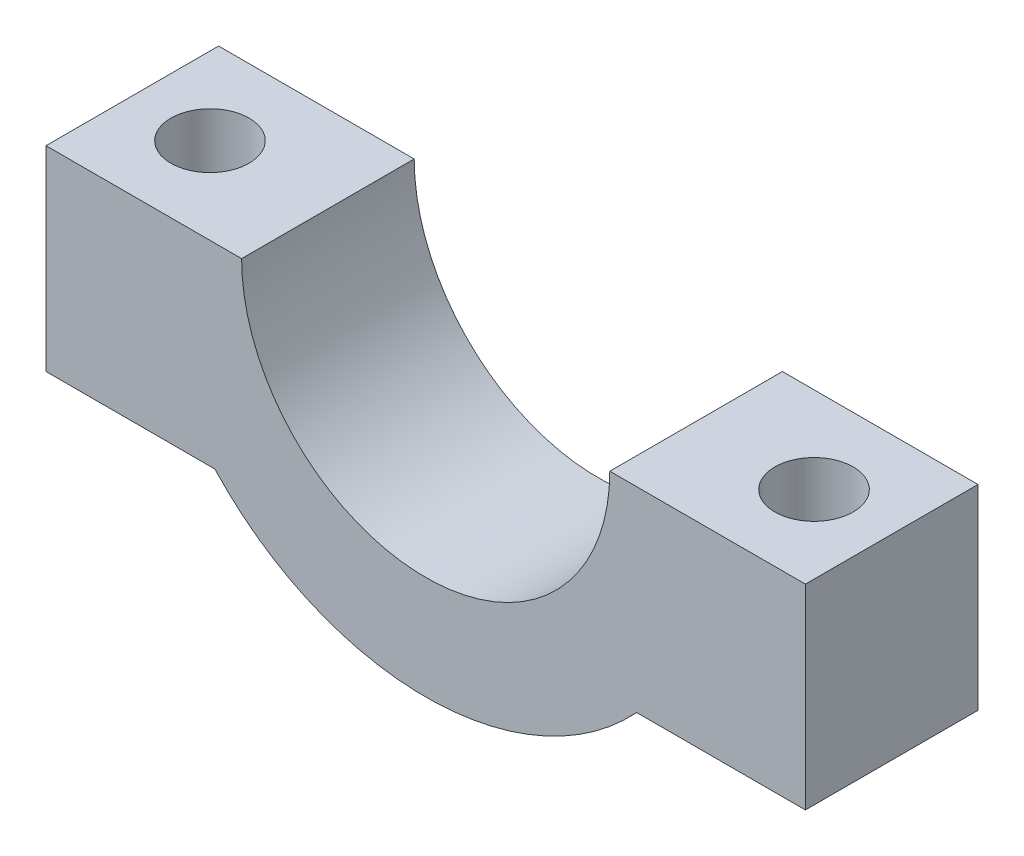
ISO-10303-21;
HEADER;
FILE_DESCRIPTION(('STEP AP214'),'2;1');
FILE_NAME('part.step','',(''),(''),'','','');
FILE_SCHEMA(('AUTOMOTIVE_DESIGN { 1 0 10303 214 1 1 1 1 }'));
ENDSEC;
DATA;
#1=APPLICATION_CONTEXT('core data for automotive mechanical design processes');
#2=APPLICATION_PROTOCOL_DEFINITION('international standard','automotive_design',2000,#1);
#3=PRODUCT_CONTEXT('',#1,'mechanical');
#4=PRODUCT('Part','Part','',(#3));
#5=PRODUCT_RELATED_PRODUCT_CATEGORY('part','',(#4));
#6=PRODUCT_DEFINITION_FORMATION('','',#4);
#7=PRODUCT_DEFINITION_CONTEXT('part definition',#1,'design');
#8=PRODUCT_DEFINITION('design','',#6,#7);
#9=PRODUCT_DEFINITION_SHAPE('','',#8);
#10=(LENGTH_UNIT() NAMED_UNIT(*) SI_UNIT(.MILLI.,.METRE.));
#11=(NAMED_UNIT(*) PLANE_ANGLE_UNIT() SI_UNIT($,.RADIAN.));
#12=(NAMED_UNIT(*) SI_UNIT($,.STERADIAN.) SOLID_ANGLE_UNIT());
#13=UNCERTAINTY_MEASURE_WITH_UNIT(LENGTH_MEASURE(1.E-05),#10,'distance_accuracy_value','');
#14=(GEOMETRIC_REPRESENTATION_CONTEXT(3) GLOBAL_UNCERTAINTY_ASSIGNED_CONTEXT((#13)) GLOBAL_UNIT_ASSIGNED_CONTEXT((#10,
#11,#12)) REPRESENTATION_CONTEXT('',''));
#15=CARTESIAN_POINT('',(0.,0.,0.));
#16=DIRECTION('',(0.,0.,1.));
#17=DIRECTION('',(1.,0.,0.));
#18=AXIS2_PLACEMENT_3D('',#15,#16,#17);
#19=CARTESIAN_POINT('',(0.,0.,-7.5));
#20=DIRECTION('',(0.,0.,1.));
#21=DIRECTION('',(1.,0.,0.));
#22=AXIS2_PLACEMENT_3D('',#19,#20,#21);
#23=CYLINDRICAL_SURFACE('',#22,16.);
#24=DIRECTION('',(0.,0.,1.));
#25=VECTOR('',#24,1.);
#26=CARTESIAN_POINT('',(-16.,0.,-7.5));
#27=LINE('',#26,#25);
#28=CARTESIAN_POINT('',(-16.,0.,-7.5));
#29=VERTEX_POINT('',#28);
#30=CARTESIAN_POINT('',(-16.,0.,7.5));
#31=VERTEX_POINT('',#30);
#32=EDGE_CURVE('E40',#29,#31,#27,.T.);
#33=ORIENTED_EDGE('',*,*,#32,.T.);
#34=CARTESIAN_POINT('',(0.,0.,7.5));
#35=DIRECTION('',(0.,0.,-1.));
#36=DIRECTION('',(-1.,0.,0.));
#37=AXIS2_PLACEMENT_3D('',#34,#35,#36);
#38=CIRCLE('',#37,16.);
#39=CARTESIAN_POINT('',(16.,0.,7.5));
#40=VERTEX_POINT('',#39);
#41=EDGE_CURVE('E101',#40,#31,#38,.T.);
#42=ORIENTED_EDGE('',*,*,#41,.F.);
#43=DIRECTION('',(0.,0.,1.));
#44=VECTOR('',#43,1.);
#45=CARTESIAN_POINT('',(16.,0.,-7.5));
#46=LINE('',#45,#44);
#47=CARTESIAN_POINT('',(16.,0.,-7.5));
#48=VERTEX_POINT('',#47);
#49=EDGE_CURVE('E11',#48,#40,#46,.T.);
#50=ORIENTED_EDGE('',*,*,#49,.F.);
#51=CARTESIAN_POINT('',(0.,0.,-7.5));
#52=DIRECTION('',(0.,0.,-1.));
#53=DIRECTION('',(-1.,0.,0.));
#54=AXIS2_PLACEMENT_3D('',#51,#52,#53);
#55=CIRCLE('',#54,16.);
#56=EDGE_CURVE('E102',#48,#29,#55,.T.);
#57=ORIENTED_EDGE('',*,*,#56,.T.);
#58=EDGE_LOOP('',(#33,#42,#50,#57));
#59=FACE_BOUND('',#58,.T.);
#60=ADVANCED_FACE('F37',(#59),#23,.F.);
#61=CARTESIAN_POINT('',(33.,0.,-7.5));
#62=DIRECTION('',(0.,1.,0.));
#63=DIRECTION('',(-1.,0.,0.));
#64=AXIS2_PLACEMENT_3D('',#61,#62,#63);
#65=PLANE('',#64);
#66=CARTESIAN_POINT('',(26.25,0.,0.));
#67=DIRECTION('',(0.,-1.,0.));
#68=DIRECTION('',(0.,0.,-1.));
#69=AXIS2_PLACEMENT_3D('',#66,#67,#68);
#70=CIRCLE('',#69,3.4);
#71=CARTESIAN_POINT('',(26.25,0.,-3.4));
#72=VERTEX_POINT('',#71);
#73=EDGE_CURVE('E120',#72,#72,#70,.T.);
#74=ORIENTED_EDGE('',*,*,#73,.T.);
#75=EDGE_LOOP('',(#74));
#76=FACE_BOUND('',#75,.T.);
#77=ORIENTED_EDGE('',*,*,#49,.T.);
#78=DIRECTION('',(-1.,0.,0.));
#79=VECTOR('',#78,1.);
#80=CARTESIAN_POINT('',(33.,0.,7.5));
#81=LINE('',#80,#79);
#82=CARTESIAN_POINT('',(33.,0.,7.5));
#83=VERTEX_POINT('',#82);
#84=EDGE_CURVE('E119',#83,#40,#81,.T.);
#85=ORIENTED_EDGE('',*,*,#84,.F.);
#86=DIRECTION('',(0.,0.,1.));
#87=VECTOR('',#86,1.);
#88=CARTESIAN_POINT('',(33.,0.,-7.5));
#89=LINE('',#88,#87);
#90=CARTESIAN_POINT('',(33.,0.,-7.5));
#91=VERTEX_POINT('',#90);
#92=EDGE_CURVE('E45',#91,#83,#89,.T.);
#93=ORIENTED_EDGE('',*,*,#92,.F.);
#94=DIRECTION('',(-1.,0.,0.));
#95=VECTOR('',#94,1.);
#96=CARTESIAN_POINT('',(33.,0.,-7.5));
#97=LINE('',#96,#95);
#98=EDGE_CURVE('E107',#91,#48,#97,.T.);
#99=ORIENTED_EDGE('',*,*,#98,.T.);
#100=EDGE_LOOP('',(#77,#85,#93,#99));
#101=FACE_BOUND('',#100,.T.);
#102=ADVANCED_FACE('F188',(#76,#101),#65,.T.);
#103=CARTESIAN_POINT('',(33.,-17.,-7.5));
#104=DIRECTION('',(1.,0.,0.));
#105=DIRECTION('',(0.,0.,-1.));
#106=AXIS2_PLACEMENT_3D('',#103,#104,#105);
#107=PLANE('',#106);
#108=ORIENTED_EDGE('',*,*,#92,.T.);
#109=DIRECTION('',(0.,1.,0.));
#110=VECTOR('',#109,1.);
#111=CARTESIAN_POINT('',(33.,-17.,7.5));
#112=LINE('',#111,#110);
#113=CARTESIAN_POINT('',(33.,-17.,7.5));
#114=VERTEX_POINT('',#113);
#115=EDGE_CURVE('E137',#114,#83,#112,.T.);
#116=ORIENTED_EDGE('',*,*,#115,.F.);
#117=DIRECTION('',(0.,0.,1.));
#118=VECTOR('',#117,1.);
#119=CARTESIAN_POINT('',(33.,-17.,-7.5));
#120=LINE('',#119,#118);
#121=CARTESIAN_POINT('',(33.,-17.,-7.5));
#122=VERTEX_POINT('',#121);
#123=EDGE_CURVE('E159',#122,#114,#120,.T.);
#124=ORIENTED_EDGE('',*,*,#123,.F.);
#125=DIRECTION('',(0.,1.,0.));
#126=VECTOR('',#125,1.);
#127=CARTESIAN_POINT('',(33.,-17.,-7.5));
#128=LINE('',#127,#126);
#129=EDGE_CURVE('E155',#122,#91,#128,.T.);
#130=ORIENTED_EDGE('',*,*,#129,.T.);
#131=EDGE_LOOP('',(#108,#116,#124,#130));
#132=FACE_BOUND('',#131,.T.);
#133=ADVANCED_FACE('F187',(#132),#107,.T.);
#134=CARTESIAN_POINT('',(33.,-17.,-7.5));
#135=DIRECTION('',(0.,-1.,0.));
#136=DIRECTION('',(1.,0.,0.));
#137=AXIS2_PLACEMENT_3D('',#134,#135,#136);
#138=PLANE('',#137);
#139=CARTESIAN_POINT('',(26.25,-17.,0.));
#140=DIRECTION('',(0.,-1.,0.));
#141=DIRECTION('',(0.,0.,-1.));
#142=AXIS2_PLACEMENT_3D('',#139,#140,#141);
#143=CIRCLE('',#142,3.4);
#144=CARTESIAN_POINT('',(26.25,-17.,-3.4));
#145=VERTEX_POINT('',#144);
#146=EDGE_CURVE('E123',#145,#145,#143,.T.);
#147=ORIENTED_EDGE('',*,*,#146,.F.);
#148=EDGE_LOOP('',(#147));
#149=FACE_BOUND('',#148,.T.);
#150=ORIENTED_EDGE('',*,*,#123,.T.);
#151=DIRECTION('',(1.,0.,0.));
#152=VECTOR('',#151,1.);
#153=CARTESIAN_POINT('',(33.,-17.,7.5));
#154=LINE('',#153,#152);
#155=CARTESIAN_POINT('',(18.3303027798232,-17.,7.5));
#156=VERTEX_POINT('',#155);
#157=EDGE_CURVE('E134',#156,#114,#154,.T.);
#158=ORIENTED_EDGE('',*,*,#157,.F.);
#159=DIRECTION('',(0.,0.,1.));
#160=VECTOR('',#159,1.);
#161=CARTESIAN_POINT('',(18.3303027798232,-17.,-7.5));
#162=LINE('',#161,#160);
#163=CARTESIAN_POINT('',(18.3303027798232,-17.,-7.5));
#164=VERTEX_POINT('',#163);
#165=EDGE_CURVE('E161',#164,#156,#162,.T.);
#166=ORIENTED_EDGE('',*,*,#165,.F.);
#167=DIRECTION('',(1.,0.,0.));
#168=VECTOR('',#167,1.);
#169=CARTESIAN_POINT('',(33.,-17.,-7.5));
#170=LINE('',#169,#168);
#171=EDGE_CURVE('E152',#164,#122,#170,.T.);
#172=ORIENTED_EDGE('',*,*,#171,.T.);
#173=EDGE_LOOP('',(#150,#158,#166,#172));
#174=FACE_BOUND('',#173,.T.);
#175=ADVANCED_FACE('F183',(#149,#174),#138,.T.);
#176=CARTESIAN_POINT('',(0.,0.,-7.5));
#177=DIRECTION('',(0.,0.,1.));
#178=DIRECTION('',(1.,0.,0.));
#179=AXIS2_PLACEMENT_3D('',#176,#177,#178);
#180=CYLINDRICAL_SURFACE('',#179,24.9999999999999);
#181=ORIENTED_EDGE('',*,*,#165,.T.);
#182=CARTESIAN_POINT('',(0.,0.,7.5));
#183=DIRECTION('',(0.,0.,1.));
#184=DIRECTION('',(-1.,0.,0.));
#185=AXIS2_PLACEMENT_3D('',#182,#183,#184);
#186=CIRCLE('',#185,24.9999999999999);
#187=CARTESIAN_POINT('',(-18.3303027798232,-17.,7.5));
#188=VERTEX_POINT('',#187);
#189=EDGE_CURVE('E131',#188,#156,#186,.T.);
#190=ORIENTED_EDGE('',*,*,#189,.F.);
#191=DIRECTION('',(0.,0.,1.));
#192=VECTOR('',#191,1.);
#193=CARTESIAN_POINT('',(-18.3303027798232,-17.,-7.5));
#194=LINE('',#193,#192);
#195=CARTESIAN_POINT('',(-18.3303027798232,-17.,-7.5));
#196=VERTEX_POINT('',#195);
#197=EDGE_CURVE('E163',#196,#188,#194,.T.);
#198=ORIENTED_EDGE('',*,*,#197,.F.);
#199=CARTESIAN_POINT('',(0.,0.,-7.5));
#200=DIRECTION('',(0.,0.,1.));
#201=DIRECTION('',(-1.,0.,0.));
#202=AXIS2_PLACEMENT_3D('',#199,#200,#201);
#203=CIRCLE('',#202,24.9999999999999);
#204=EDGE_CURVE('E149',#196,#164,#203,.T.);
#205=ORIENTED_EDGE('',*,*,#204,.T.);
#206=EDGE_LOOP('',(#181,#190,#198,#205));
#207=FACE_BOUND('',#206,.T.);
#208=ADVANCED_FACE('F176',(#207),#180,.T.);
#209=CARTESIAN_POINT('',(-18.3303027798232,-17.,-7.5));
#210=DIRECTION('',(0.,-1.,0.));
#211=DIRECTION('',(1.,0.,0.));
#212=AXIS2_PLACEMENT_3D('',#209,#210,#211);
#213=PLANE('',#212);
#214=CARTESIAN_POINT('',(-26.25,-17.,0.));
#215=DIRECTION('',(0.,-1.,0.));
#216=DIRECTION('',(0.,0.,-1.));
#217=AXIS2_PLACEMENT_3D('',#214,#215,#216);
#218=CIRCLE('',#217,3.4);
#219=CARTESIAN_POINT('',(-26.25,-17.,-3.4));
#220=VERTEX_POINT('',#219);
#221=EDGE_CURVE('E218',#220,#220,#218,.T.);
#222=ORIENTED_EDGE('',*,*,#221,.F.);
#223=EDGE_LOOP('',(#222));
#224=FACE_BOUND('',#223,.T.);
#225=ORIENTED_EDGE('',*,*,#197,.T.);
#226=DIRECTION('',(1.,0.,0.));
#227=VECTOR('',#226,1.);
#228=CARTESIAN_POINT('',(-18.3303027798232,-17.,7.5));
#229=LINE('',#228,#227);
#230=CARTESIAN_POINT('',(-33.,-17.,7.5));
#231=VERTEX_POINT('',#230);
#232=EDGE_CURVE('E128',#231,#188,#229,.T.);
#233=ORIENTED_EDGE('',*,*,#232,.F.);
#234=DIRECTION('',(0.,0.,1.));
#235=VECTOR('',#234,1.);
#236=CARTESIAN_POINT('',(-33.,-17.,-7.5));
#237=LINE('',#236,#235);
#238=CARTESIAN_POINT('',(-33.,-17.,-7.5));
#239=VERTEX_POINT('',#238);
#240=EDGE_CURVE('E165',#239,#231,#237,.T.);
#241=ORIENTED_EDGE('',*,*,#240,.F.);
#242=DIRECTION('',(1.,0.,0.));
#243=VECTOR('',#242,1.);
#244=CARTESIAN_POINT('',(-18.3303027798232,-17.,-7.5));
#245=LINE('',#244,#243);
#246=EDGE_CURVE('E146',#239,#196,#245,.T.);
#247=ORIENTED_EDGE('',*,*,#246,.T.);
#248=EDGE_LOOP('',(#225,#233,#241,#247));
#249=FACE_BOUND('',#248,.T.);
#250=ADVANCED_FACE('F173',(#224,#249),#213,.T.);
#251=CARTESIAN_POINT('',(-33.,-17.,-7.5));
#252=DIRECTION('',(-1.,0.,0.));
#253=DIRECTION('',(0.,0.,1.));
#254=AXIS2_PLACEMENT_3D('',#251,#252,#253);
#255=PLANE('',#254);
#256=ORIENTED_EDGE('',*,*,#240,.T.);
#257=DIRECTION('',(0.,-1.,0.));
#258=VECTOR('',#257,1.);
#259=CARTESIAN_POINT('',(-33.,-17.,7.5));
#260=LINE('',#259,#258);
#261=CARTESIAN_POINT('',(-33.,0.,7.5));
#262=VERTEX_POINT('',#261);
#263=EDGE_CURVE('E114',#262,#231,#260,.T.);
#264=ORIENTED_EDGE('',*,*,#263,.F.);
#265=DIRECTION('',(0.,0.,1.));
#266=VECTOR('',#265,1.);
#267=CARTESIAN_POINT('',(-33.,0.,-7.5));
#268=LINE('',#267,#266);
#269=CARTESIAN_POINT('',(-33.,0.,-7.5));
#270=VERTEX_POINT('',#269);
#271=EDGE_CURVE('E106',#270,#262,#268,.T.);
#272=ORIENTED_EDGE('',*,*,#271,.F.);
#273=DIRECTION('',(0.,-1.,0.));
#274=VECTOR('',#273,1.);
#275=CARTESIAN_POINT('',(-33.,-17.,-7.5));
#276=LINE('',#275,#274);
#277=EDGE_CURVE('E143',#270,#239,#276,.T.);
#278=ORIENTED_EDGE('',*,*,#277,.T.);
#279=EDGE_LOOP('',(#256,#264,#272,#278));
#280=FACE_BOUND('',#279,.T.);
#281=ADVANCED_FACE('F167',(#280),#255,.T.);
#282=CARTESIAN_POINT('',(-33.,0.,-7.5));
#283=DIRECTION('',(0.,1.,0.));
#284=DIRECTION('',(-1.,0.,0.));
#285=AXIS2_PLACEMENT_3D('',#282,#283,#284);
#286=PLANE('',#285);
#287=CARTESIAN_POINT('',(-26.25,0.,0.));
#288=DIRECTION('',(0.,-1.,0.));
#289=DIRECTION('',(0.,0.,-1.));
#290=AXIS2_PLACEMENT_3D('',#287,#288,#289);
#291=CIRCLE('',#290,3.4);
#292=CARTESIAN_POINT('',(-26.25,0.,-3.4));
#293=VERTEX_POINT('',#292);
#294=EDGE_CURVE('E216',#293,#293,#291,.T.);
#295=ORIENTED_EDGE('',*,*,#294,.T.);
#296=EDGE_LOOP('',(#295));
#297=FACE_BOUND('',#296,.T.);
#298=ORIENTED_EDGE('',*,*,#271,.T.);
#299=DIRECTION('',(-1.,0.,0.));
#300=VECTOR('',#299,1.);
#301=CARTESIAN_POINT('',(-33.,0.,7.5));
#302=LINE('',#301,#300);
#303=EDGE_CURVE('E109',#31,#262,#302,.T.);
#304=ORIENTED_EDGE('',*,*,#303,.F.);
#305=ORIENTED_EDGE('',*,*,#32,.F.);
#306=DIRECTION('',(-1.,0.,0.));
#307=VECTOR('',#306,1.);
#308=CARTESIAN_POINT('',(-33.,0.,-7.5));
#309=LINE('',#308,#307);
#310=EDGE_CURVE('E141',#29,#270,#309,.T.);
#311=ORIENTED_EDGE('',*,*,#310,.T.);
#312=EDGE_LOOP('',(#298,#304,#305,#311));
#313=FACE_BOUND('',#312,.T.);
#314=ADVANCED_FACE('F110',(#297,#313),#286,.T.);
#315=CARTESIAN_POINT('',(0.,0.,-7.5));
#316=DIRECTION('',(0.,0.,-1.));
#317=DIRECTION('',(-1.,0.,0.));
#318=AXIS2_PLACEMENT_3D('',#315,#316,#317);
#319=PLANE('',#318);
#320=ORIENTED_EDGE('',*,*,#56,.F.);
#321=ORIENTED_EDGE('',*,*,#98,.F.);
#322=ORIENTED_EDGE('',*,*,#129,.F.);
#323=ORIENTED_EDGE('',*,*,#171,.F.);
#324=ORIENTED_EDGE('',*,*,#204,.F.);
#325=ORIENTED_EDGE('',*,*,#246,.F.);
#326=ORIENTED_EDGE('',*,*,#277,.F.);
#327=ORIENTED_EDGE('',*,*,#310,.F.);
#328=EDGE_LOOP('',(#320,#321,#322,#323,#324,#325,#326,#327));
#329=FACE_BOUND('',#328,.T.);
#330=ADVANCED_FACE('F179',(#329),#319,.T.);
#331=CARTESIAN_POINT('',(0.,0.,7.5));
#332=DIRECTION('',(0.,0.,-1.));
#333=DIRECTION('',(-1.,0.,0.));
#334=AXIS2_PLACEMENT_3D('',#331,#332,#333);
#335=PLANE('',#334);
#336=ORIENTED_EDGE('',*,*,#41,.T.);
#337=ORIENTED_EDGE('',*,*,#303,.T.);
#338=ORIENTED_EDGE('',*,*,#263,.T.);
#339=ORIENTED_EDGE('',*,*,#232,.T.);
#340=ORIENTED_EDGE('',*,*,#189,.T.);
#341=ORIENTED_EDGE('',*,*,#157,.T.);
#342=ORIENTED_EDGE('',*,*,#115,.T.);
#343=ORIENTED_EDGE('',*,*,#84,.T.);
#344=EDGE_LOOP('',(#336,#337,#338,#339,#340,#341,#342,#343));
#345=FACE_BOUND('',#344,.T.);
#346=ADVANCED_FACE('F117',(#345),#335,.F.);
#347=CARTESIAN_POINT('',(26.25,-17.,0.));
#348=DIRECTION('',(0.,-1.,0.));
#349=DIRECTION('',(0.,0.,-1.));
#350=AXIS2_PLACEMENT_3D('',#347,#348,#349);
#351=CYLINDRICAL_SURFACE('',#350,3.4);
#352=ORIENTED_EDGE('',*,*,#73,.F.);
#353=EDGE_LOOP('',(#352));
#354=FACE_BOUND('',#353,.T.);
#355=ORIENTED_EDGE('',*,*,#146,.T.);
#356=EDGE_LOOP('',(#355));
#357=FACE_BOUND('',#356,.T.);
#358=ADVANCED_FACE('F227',(#354,#357),#351,.F.);
#359=CARTESIAN_POINT('',(-26.25,-17.,0.));
#360=DIRECTION('',(0.,-1.,0.));
#361=DIRECTION('',(0.,0.,-1.));
#362=AXIS2_PLACEMENT_3D('',#359,#360,#361);
#363=CYLINDRICAL_SURFACE('',#362,3.4);
#364=ORIENTED_EDGE('',*,*,#294,.F.);
#365=EDGE_LOOP('',(#364));
#366=FACE_BOUND('',#365,.T.);
#367=ORIENTED_EDGE('',*,*,#221,.T.);
#368=EDGE_LOOP('',(#367));
#369=FACE_BOUND('',#368,.T.);
#370=ADVANCED_FACE('F225',(#366,#369),#363,.F.);
#371=CLOSED_SHELL('',(#60,#102,#133,#175,#208,#250,#281,#314,#330,#346,#358,#370));
#372=MANIFOLD_SOLID_BREP('B2',#371);
#373=ADVANCED_BREP_SHAPE_REPRESENTATION('',(#18,#372),#14);
#374=SHAPE_DEFINITION_REPRESENTATION(#9,#373);
ENDSEC;
END-ISO-10303-21;
